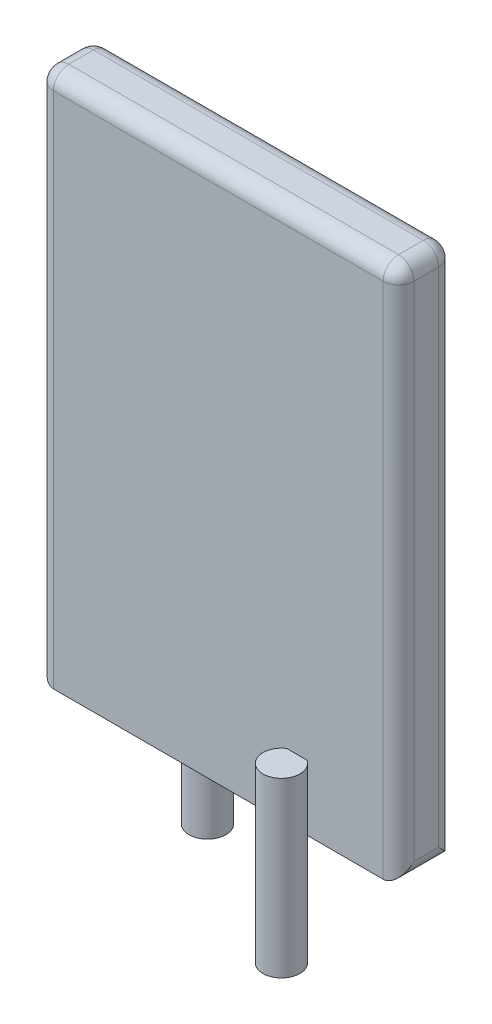
ISO-10303-21;
HEADER;
FILE_DESCRIPTION(('STEP AP214'),'2;1');
FILE_NAME('part.step','',(''),(''),'','','');
FILE_SCHEMA(('AUTOMOTIVE_DESIGN { 1 0 10303 214 1 1 1 1 }'));
ENDSEC;
DATA;
#1=APPLICATION_CONTEXT('core data for automotive mechanical design processes');
#2=APPLICATION_PROTOCOL_DEFINITION('international standard','automotive_design',2000,#1);
#3=PRODUCT_CONTEXT('',#1,'mechanical');
#4=PRODUCT('Part','Part','',(#3));
#5=PRODUCT_RELATED_PRODUCT_CATEGORY('part','',(#4));
#6=PRODUCT_DEFINITION_FORMATION('','',#4);
#7=PRODUCT_DEFINITION_CONTEXT('part definition',#1,'design');
#8=PRODUCT_DEFINITION('design','',#6,#7);
#9=PRODUCT_DEFINITION_SHAPE('','',#8);
#10=(LENGTH_UNIT() NAMED_UNIT(*) SI_UNIT(.MILLI.,.METRE.));
#11=(NAMED_UNIT(*) PLANE_ANGLE_UNIT() SI_UNIT($,.RADIAN.));
#12=(NAMED_UNIT(*) SI_UNIT($,.STERADIAN.) SOLID_ANGLE_UNIT());
#13=UNCERTAINTY_MEASURE_WITH_UNIT(LENGTH_MEASURE(1.E-05),#10,'distance_accuracy_value','');
#14=(GEOMETRIC_REPRESENTATION_CONTEXT(3) GLOBAL_UNCERTAINTY_ASSIGNED_CONTEXT((#13)) GLOBAL_UNIT_ASSIGNED_CONTEXT((#10,
#11,#12)) REPRESENTATION_CONTEXT('',''));
#15=CARTESIAN_POINT('',(0.,0.,0.));
#16=DIRECTION('',(0.,0.,1.));
#17=DIRECTION('',(1.,0.,0.));
#18=AXIS2_PLACEMENT_3D('',#15,#16,#17);
#19=CARTESIAN_POINT('',(-2.55,-12.15,-1.3));
#20=DIRECTION('',(0.,1.,0.));
#21=DIRECTION('',(0.,0.,1.));
#22=AXIS2_PLACEMENT_3D('',#19,#20,#21);
#23=PLANE('',#22);
#24=CARTESIAN_POINT('',(-2.55,-12.15,-1.3));
#25=DIRECTION('',(0.,1.,0.));
#26=DIRECTION('',(0.,0.,1.));
#27=AXIS2_PLACEMENT_3D('',#24,#25,#26);
#28=CIRCLE('',#27,0.599999999999999);
#29=CARTESIAN_POINT('',(-2.55,-12.15,-0.700000000000002));
#30=VERTEX_POINT('',#29);
#31=EDGE_CURVE('E11',#30,#30,#28,.T.);
#32=ORIENTED_EDGE('',*,*,#31,.F.);
#33=EDGE_LOOP('',(#32));
#34=FACE_BOUND('',#33,.T.);
#35=ADVANCED_FACE('F48',(#34),#23,.F.);
#36=CARTESIAN_POINT('',(-2.55,-2.22267848256585,-1.3));
#37=DIRECTION('',(0.,1.,0.));
#38=DIRECTION('',(0.,0.,1.));
#39=AXIS2_PLACEMENT_3D('',#36,#37,#38);
#40=CYLINDRICAL_SURFACE('',#39,0.599999999999999);
#41=CARTESIAN_POINT('',(-2.55,-6.5404643789514,-1.3));
#42=DIRECTION('',(0.,1.,0.));
#43=DIRECTION('',(0.,0.,1.));
#44=AXIS2_PLACEMENT_3D('',#41,#42,#43);
#45=CIRCLE('',#44,0.6);
#46=CARTESIAN_POINT('',(-2.55,-6.5404643789514,-0.700000000000001));
#47=VERTEX_POINT('',#46);
#48=EDGE_CURVE('E55',#47,#47,#45,.T.);
#49=ORIENTED_EDGE('',*,*,#48,.F.);
#50=EDGE_LOOP('',(#49));
#51=FACE_BOUND('',#50,.T.);
#52=ORIENTED_EDGE('',*,*,#31,.T.);
#53=EDGE_LOOP('',(#52));
#54=FACE_BOUND('',#53,.T.);
#55=ADVANCED_FACE('F64',(#51,#54),#40,.T.);
#56=CARTESIAN_POINT('',(-2.55,-6.5404643789514,-1.9));
#57=DIRECTION('',(0.,-1.,0.));
#58=DIRECTION('',(0.,0.,-1.));
#59=AXIS2_PLACEMENT_3D('',#56,#57,#58);
#60=PLANE('',#59);
#61=ORIENTED_EDGE('',*,*,#48,.T.);
#62=EDGE_LOOP('',(#61));
#63=FACE_BOUND('',#62,.T.);
#64=ADVANCED_FACE('F62',(#63),#60,.F.);
#65=CLOSED_SHELL('',(#35,#55,#64));
#66=MANIFOLD_SOLID_BREP('B2',#65);
#67=CARTESIAN_POINT('',(2.55,-12.15,1.4));
#68=DIRECTION('',(0.,1.,0.));
#69=DIRECTION('',(0.,0.,1.));
#70=AXIS2_PLACEMENT_3D('',#67,#68,#69);
#71=PLANE('',#70);
#72=CARTESIAN_POINT('',(2.55,-12.15,1.4));
#73=DIRECTION('',(0.,1.,0.));
#74=DIRECTION('',(0.,0.,1.));
#75=AXIS2_PLACEMENT_3D('',#72,#73,#74);
#76=CIRCLE('',#75,0.599999999999999);
#77=CARTESIAN_POINT('',(2.55,-12.15,2.));
#78=VERTEX_POINT('',#77);
#79=EDGE_CURVE('E47',#78,#78,#76,.T.);
#80=ORIENTED_EDGE('',*,*,#79,.F.);
#81=EDGE_LOOP('',(#80));
#82=FACE_BOUND('',#81,.T.);
#83=ADVANCED_FACE('F103',(#82),#71,.F.);
#84=CARTESIAN_POINT('',(2.55,-2.22267848256585,1.4));
#85=DIRECTION('',(0.,1.,0.));
#86=DIRECTION('',(0.,0.,1.));
#87=AXIS2_PLACEMENT_3D('',#84,#85,#86);
#88=CYLINDRICAL_SURFACE('',#87,0.599999999999999);
#89=CARTESIAN_POINT('',(2.55,-6.5404643789514,1.4));
#90=DIRECTION('',(0.,1.,0.));
#91=DIRECTION('',(0.,0.,1.));
#92=AXIS2_PLACEMENT_3D('',#89,#90,#91);
#93=CIRCLE('',#92,0.6);
#94=CARTESIAN_POINT('',(2.55,-6.5404643789514,2.));
#95=VERTEX_POINT('',#94);
#96=EDGE_CURVE('E110',#95,#95,#93,.T.);
#97=ORIENTED_EDGE('',*,*,#96,.F.);
#98=EDGE_LOOP('',(#97));
#99=FACE_BOUND('',#98,.T.);
#100=ORIENTED_EDGE('',*,*,#79,.T.);
#101=EDGE_LOOP('',(#100));
#102=FACE_BOUND('',#101,.T.);
#103=ADVANCED_FACE('F119',(#99,#102),#88,.T.);
#104=CARTESIAN_POINT('',(2.55,-6.5404643789514,0.8));
#105=DIRECTION('',(0.,-1.,0.));
#106=DIRECTION('',(0.,0.,-1.));
#107=AXIS2_PLACEMENT_3D('',#104,#105,#106);
#108=PLANE('',#107);
#109=ORIENTED_EDGE('',*,*,#96,.T.);
#110=EDGE_LOOP('',(#109));
#111=FACE_BOUND('',#110,.T.);
#112=ADVANCED_FACE('F117',(#111),#108,.F.);
#113=CLOSED_SHELL('',(#83,#103,#112));
#114=MANIFOLD_SOLID_BREP('B6',#113);
#115=CARTESIAN_POINT('',(-5.85,8.65,0.9));
#116=DIRECTION('',(1.,0.,0.));
#117=DIRECTION('',(0.,0.,-1.));
#118=AXIS2_PLACEMENT_3D('',#115,#116,#117);
#119=PLANE('',#118);
#120=DIRECTION('',(0.,-1.,0.));
#121=VECTOR('',#120,1.);
#122=CARTESIAN_POINT('',(-5.85,8.65,-0.4));
#123=LINE('',#122,#121);
#124=CARTESIAN_POINT('',(-5.85,8.15,-0.4));
#125=VERTEX_POINT('',#124);
#126=CARTESIAN_POINT('',(-5.85,-8.15,-0.4));
#127=VERTEX_POINT('',#126);
#128=EDGE_CURVE('E313',#125,#127,#123,.T.);
#129=ORIENTED_EDGE('',*,*,#128,.T.);
#130=DIRECTION('',(0.,0.,-1.));
#131=VECTOR('',#130,1.);
#132=CARTESIAN_POINT('',(-5.85,-8.15,0.9));
#133=LINE('',#132,#131);
#134=CARTESIAN_POINT('',(-5.85,-8.15,0.4));
#135=VERTEX_POINT('',#134);
#136=EDGE_CURVE('E174',#127,#135,#133,.F.);
#137=ORIENTED_EDGE('',*,*,#136,.T.);
#138=DIRECTION('',(0.,-1.,0.));
#139=VECTOR('',#138,1.);
#140=CARTESIAN_POINT('',(-5.85,8.65,0.4));
#141=LINE('',#140,#139);
#142=CARTESIAN_POINT('',(-5.85,8.15,0.4));
#143=VERTEX_POINT('',#142);
#144=EDGE_CURVE('E310',#135,#143,#141,.F.);
#145=ORIENTED_EDGE('',*,*,#144,.T.);
#146=DIRECTION('',(0.,0.,-1.));
#147=VECTOR('',#146,1.);
#148=CARTESIAN_POINT('',(-5.85,8.15,0.9));
#149=LINE('',#148,#147);
#150=EDGE_CURVE('E307',#143,#125,#149,.T.);
#151=ORIENTED_EDGE('',*,*,#150,.T.);
#152=EDGE_LOOP('',(#129,#137,#145,#151));
#153=FACE_BOUND('',#152,.T.);
#154=ADVANCED_FACE('F149',(#153),#119,.F.);
#155=CARTESIAN_POINT('',(-5.85,-8.65,0.9));
#156=DIRECTION('',(0.,1.,0.));
#157=DIRECTION('',(0.,0.,1.));
#158=AXIS2_PLACEMENT_3D('',#155,#156,#157);
#159=PLANE('',#158);
#160=DIRECTION('',(1.,0.,0.));
#161=VECTOR('',#160,1.);
#162=CARTESIAN_POINT('',(-5.85,-8.65,0.9));
#163=LINE('',#162,#161);
#164=CARTESIAN_POINT('',(-5.35,-8.65,0.9));
#165=VERTEX_POINT('',#164);
#166=CARTESIAN_POINT('',(5.35,-8.65,0.9));
#167=VERTEX_POINT('',#166);
#168=EDGE_CURVE('E263',#165,#167,#163,.T.);
#169=ORIENTED_EDGE('',*,*,#168,.F.);
#170=DIRECTION('',(0.,0.,-1.));
#171=VECTOR('',#170,1.);
#172=CARTESIAN_POINT('',(-5.35,-8.65,0.9));
#173=LINE('',#172,#171);
#174=CARTESIAN_POINT('',(-5.35,-8.65,-0.9));
#175=VERTEX_POINT('',#174);
#176=EDGE_CURVE('E101',#165,#175,#173,.T.);
#177=ORIENTED_EDGE('',*,*,#176,.T.);
#178=DIRECTION('',(1.,0.,0.));
#179=VECTOR('',#178,1.);
#180=CARTESIAN_POINT('',(-5.85,-8.65,-0.9));
#181=LINE('',#180,#179);
#182=CARTESIAN_POINT('',(5.35,-8.65,-0.9));
#183=VERTEX_POINT('',#182);
#184=EDGE_CURVE('E364',#175,#183,#181,.T.);
#185=ORIENTED_EDGE('',*,*,#184,.T.);
#186=DIRECTION('',(0.,0.,-1.));
#187=VECTOR('',#186,1.);
#188=CARTESIAN_POINT('',(5.35,-8.65,0.9));
#189=LINE('',#188,#187);
#190=EDGE_CURVE('E159',#183,#167,#189,.F.);
#191=ORIENTED_EDGE('',*,*,#190,.T.);
#192=EDGE_LOOP('',(#169,#177,#185,#191));
#193=FACE_BOUND('',#192,.T.);
#194=ADVANCED_FACE('F397',(#193),#159,.F.);
#195=CARTESIAN_POINT('',(5.85,8.65,0.9));
#196=DIRECTION('',(-1.,0.,0.));
#197=DIRECTION('',(0.,0.,1.));
#198=AXIS2_PLACEMENT_3D('',#195,#196,#197);
#199=PLANE('',#198);
#200=DIRECTION('',(0.,1.,0.));
#201=VECTOR('',#200,1.);
#202=CARTESIAN_POINT('',(5.85,-8.65,0.4));
#203=LINE('',#202,#201);
#204=CARTESIAN_POINT('',(5.85,8.15,0.4));
#205=VERTEX_POINT('',#204);
#206=CARTESIAN_POINT('',(5.85,-8.15,0.4));
#207=VERTEX_POINT('',#206);
#208=EDGE_CURVE('E297',#205,#207,#203,.F.);
#209=ORIENTED_EDGE('',*,*,#208,.T.);
#210=DIRECTION('',(0.,0.,-1.));
#211=VECTOR('',#210,1.);
#212=CARTESIAN_POINT('',(5.85,-8.15,0.9));
#213=LINE('',#212,#211);
#214=CARTESIAN_POINT('',(5.85,-8.15,-0.4));
#215=VERTEX_POINT('',#214);
#216=EDGE_CURVE('E304',#207,#215,#213,.T.);
#217=ORIENTED_EDGE('',*,*,#216,.T.);
#218=DIRECTION('',(0.,1.,0.));
#219=VECTOR('',#218,1.);
#220=CARTESIAN_POINT('',(5.85,8.65,-0.4));
#221=LINE('',#220,#219);
#222=CARTESIAN_POINT('',(5.85,8.15,-0.4));
#223=VERTEX_POINT('',#222);
#224=EDGE_CURVE('E300',#215,#223,#221,.T.);
#225=ORIENTED_EDGE('',*,*,#224,.T.);
#226=DIRECTION('',(0.,0.,-1.));
#227=VECTOR('',#226,1.);
#228=CARTESIAN_POINT('',(5.85,8.15,0.9));
#229=LINE('',#228,#227);
#230=EDGE_CURVE('E294',#223,#205,#229,.F.);
#231=ORIENTED_EDGE('',*,*,#230,.T.);
#232=EDGE_LOOP('',(#209,#217,#225,#231));
#233=FACE_BOUND('',#232,.T.);
#234=ADVANCED_FACE('F409',(#233),#199,.F.);
#235=CARTESIAN_POINT('',(-5.85,8.65,0.9));
#236=DIRECTION('',(0.,-1.,0.));
#237=DIRECTION('',(0.,0.,-1.));
#238=AXIS2_PLACEMENT_3D('',#235,#236,#237);
#239=PLANE('',#238);
#240=DIRECTION('',(-1.,0.,0.));
#241=VECTOR('',#240,1.);
#242=CARTESIAN_POINT('',(5.85,8.65,0.4));
#243=LINE('',#242,#241);
#244=CARTESIAN_POINT('',(-5.35,8.65,0.4));
#245=VERTEX_POINT('',#244);
#246=CARTESIAN_POINT('',(5.35,8.65,0.4));
#247=VERTEX_POINT('',#246);
#248=EDGE_CURVE('E262',#245,#247,#243,.F.);
#249=ORIENTED_EDGE('',*,*,#248,.T.);
#250=DIRECTION('',(0.,0.,-1.));
#251=VECTOR('',#250,1.);
#252=CARTESIAN_POINT('',(5.35,8.65,0.9));
#253=LINE('',#252,#251);
#254=CARTESIAN_POINT('',(5.35,8.65,-0.4));
#255=VERTEX_POINT('',#254);
#256=EDGE_CURVE('E267',#247,#255,#253,.T.);
#257=ORIENTED_EDGE('',*,*,#256,.T.);
#258=DIRECTION('',(-1.,0.,0.));
#259=VECTOR('',#258,1.);
#260=CARTESIAN_POINT('',(-5.85,8.65,-0.4));
#261=LINE('',#260,#259);
#262=CARTESIAN_POINT('',(-5.35,8.65,-0.4));
#263=VERTEX_POINT('',#262);
#264=EDGE_CURVE('E235',#255,#263,#261,.T.);
#265=ORIENTED_EDGE('',*,*,#264,.T.);
#266=DIRECTION('',(0.,0.,-1.));
#267=VECTOR('',#266,1.);
#268=CARTESIAN_POINT('',(-5.35,8.65,0.9));
#269=LINE('',#268,#267);
#270=EDGE_CURVE('E255',#263,#245,#269,.F.);
#271=ORIENTED_EDGE('',*,*,#270,.T.);
#272=EDGE_LOOP('',(#249,#257,#265,#271));
#273=FACE_BOUND('',#272,.T.);
#274=ADVANCED_FACE('F265',(#273),#239,.F.);
#275=CARTESIAN_POINT('',(0.,0.,0.9));
#276=DIRECTION('',(0.,0.,1.));
#277=DIRECTION('',(1.,0.,0.));
#278=AXIS2_PLACEMENT_3D('',#275,#276,#277);
#279=PLANE('',#278);
#280=ORIENTED_EDGE('',*,*,#168,.T.);
#281=DIRECTION('',(0.,1.,0.));
#282=VECTOR('',#281,1.);
#283=CARTESIAN_POINT('',(5.35,8.65,0.9));
#284=LINE('',#283,#282);
#285=CARTESIAN_POINT('',(5.35,8.15,0.9));
#286=VERTEX_POINT('',#285);
#287=EDGE_CURVE('E291',#167,#286,#284,.T.);
#288=ORIENTED_EDGE('',*,*,#287,.T.);
#289=DIRECTION('',(-1.,0.,0.));
#290=VECTOR('',#289,1.);
#291=CARTESIAN_POINT('',(-5.85,8.15,0.9));
#292=LINE('',#291,#290);
#293=CARTESIAN_POINT('',(-5.35,8.15,0.9));
#294=VERTEX_POINT('',#293);
#295=EDGE_CURVE('E288',#286,#294,#292,.T.);
#296=ORIENTED_EDGE('',*,*,#295,.T.);
#297=DIRECTION('',(0.,-1.,0.));
#298=VECTOR('',#297,1.);
#299=CARTESIAN_POINT('',(-5.35,-8.65,0.9));
#300=LINE('',#299,#298);
#301=EDGE_CURVE('E285',#294,#165,#300,.T.);
#302=ORIENTED_EDGE('',*,*,#301,.T.);
#303=EDGE_LOOP('',(#280,#288,#296,#302));
#304=FACE_BOUND('',#303,.T.);
#305=ADVANCED_FACE('F380',(#304),#279,.T.);
#306=CARTESIAN_POINT('',(0.,0.,-0.9));
#307=DIRECTION('',(0.,0.,1.));
#308=DIRECTION('',(1.,0.,0.));
#309=AXIS2_PLACEMENT_3D('',#306,#307,#308);
#310=PLANE('',#309);
#311=DIRECTION('',(-1.,0.,0.));
#312=VECTOR('',#311,1.);
#313=CARTESIAN_POINT('',(0.,8.15,-0.9));
#314=LINE('',#313,#312);
#315=CARTESIAN_POINT('',(-5.35,8.15,-0.9));
#316=VERTEX_POINT('',#315);
#317=CARTESIAN_POINT('',(5.35,8.15,-0.9));
#318=VERTEX_POINT('',#317);
#319=EDGE_CURVE('E237',#316,#318,#314,.F.);
#320=ORIENTED_EDGE('',*,*,#319,.T.);
#321=DIRECTION('',(0.,1.,0.));
#322=VECTOR('',#321,1.);
#323=CARTESIAN_POINT('',(5.35,0.,-0.9));
#324=LINE('',#323,#322);
#325=EDGE_CURVE('E282',#318,#183,#324,.F.);
#326=ORIENTED_EDGE('',*,*,#325,.T.);
#327=ORIENTED_EDGE('',*,*,#184,.F.);
#328=DIRECTION('',(0.,-1.,0.));
#329=VECTOR('',#328,1.);
#330=CARTESIAN_POINT('',(-5.35,0.,-0.9));
#331=LINE('',#330,#329);
#332=EDGE_CURVE('E274',#175,#316,#331,.F.);
#333=ORIENTED_EDGE('',*,*,#332,.T.);
#334=EDGE_LOOP('',(#320,#326,#327,#333));
#335=FACE_BOUND('',#334,.T.);
#336=ADVANCED_FACE('F399',(#335),#310,.F.);
#337=CARTESIAN_POINT('',(5.35,0.,0.4));
#338=DIRECTION('',(0.,-1.,0.));
#339=DIRECTION('',(0.,0.,-1.));
#340=AXIS2_PLACEMENT_3D('',#337,#338,#339);
#341=CYLINDRICAL_SURFACE('',#340,0.5);
#342=CARTESIAN_POINT('',(5.35,8.15,0.4));
#343=DIRECTION('',(0.,1.,0.));
#344=DIRECTION('',(0.,0.,1.));
#345=AXIS2_PLACEMENT_3D('',#342,#343,#344);
#346=CIRCLE('',#345,0.5);
#347=EDGE_CURVE('E357',#286,#205,#346,.T.);
#348=ORIENTED_EDGE('',*,*,#347,.F.);
#349=ORIENTED_EDGE('',*,*,#287,.F.);
#350=CARTESIAN_POINT('',(5.35,-8.15,0.4));
#351=DIRECTION('',(0.,-0.707106781186547,-0.707106781186547));
#352=DIRECTION('',(0.,0.707106781186547,-0.707106781186547));
#353=AXIS2_PLACEMENT_3D('',#350,#351,#352);
#354=ELLIPSE('',#353,0.707106781186547,0.5);
#355=EDGE_CURVE('E153',#207,#167,#354,.T.);
#356=ORIENTED_EDGE('',*,*,#355,.F.);
#357=ORIENTED_EDGE('',*,*,#208,.F.);
#358=EDGE_LOOP('',(#348,#349,#356,#357));
#359=FACE_BOUND('',#358,.T.);
#360=ADVANCED_FACE('F151',(#359),#341,.T.);
#361=CARTESIAN_POINT('',(0.,8.15,0.4));
#362=DIRECTION('',(1.,0.,0.));
#363=DIRECTION('',(0.,0.,-1.));
#364=AXIS2_PLACEMENT_3D('',#361,#362,#363);
#365=CYLINDRICAL_SURFACE('',#364,0.5);
#366=CARTESIAN_POINT('',(-5.35,8.15,0.4));
#367=DIRECTION('',(-1.,0.,0.));
#368=DIRECTION('',(0.,0.,1.));
#369=AXIS2_PLACEMENT_3D('',#366,#367,#368);
#370=CIRCLE('',#369,0.5);
#371=EDGE_CURVE('E350',#294,#245,#370,.T.);
#372=ORIENTED_EDGE('',*,*,#371,.F.);
#373=ORIENTED_EDGE('',*,*,#295,.F.);
#374=CARTESIAN_POINT('',(5.35,8.15,0.4));
#375=DIRECTION('',(1.,0.,0.));
#376=DIRECTION('',(0.,0.,-1.));
#377=AXIS2_PLACEMENT_3D('',#374,#375,#376);
#378=CIRCLE('',#377,0.5);
#379=EDGE_CURVE('E354',#247,#286,#378,.T.);
#380=ORIENTED_EDGE('',*,*,#379,.F.);
#381=ORIENTED_EDGE('',*,*,#248,.F.);
#382=EDGE_LOOP('',(#372,#373,#380,#381));
#383=FACE_BOUND('',#382,.T.);
#384=ADVANCED_FACE('F390',(#383),#365,.T.);
#385=CARTESIAN_POINT('',(-5.35,0.,0.4));
#386=DIRECTION('',(0.,1.,0.));
#387=DIRECTION('',(0.,0.,1.));
#388=AXIS2_PLACEMENT_3D('',#385,#386,#387);
#389=CYLINDRICAL_SURFACE('',#388,0.5);
#390=CARTESIAN_POINT('',(-5.35,-8.15,0.4));
#391=DIRECTION('',(0.,-0.707106781186547,-0.707106781186547));
#392=DIRECTION('',(0.,0.707106781186547,-0.707106781186547));
#393=AXIS2_PLACEMENT_3D('',#390,#391,#392);
#394=ELLIPSE('',#393,0.707106781186547,0.5);
#395=EDGE_CURVE('E342',#165,#135,#394,.T.);
#396=ORIENTED_EDGE('',*,*,#395,.F.);
#397=ORIENTED_EDGE('',*,*,#301,.F.);
#398=CARTESIAN_POINT('',(-5.35,8.15,0.4));
#399=DIRECTION('',(0.,1.,0.));
#400=DIRECTION('',(0.,0.,1.));
#401=AXIS2_PLACEMENT_3D('',#398,#399,#400);
#402=CIRCLE('',#401,0.5);
#403=EDGE_CURVE('E346',#143,#294,#402,.T.);
#404=ORIENTED_EDGE('',*,*,#403,.F.);
#405=ORIENTED_EDGE('',*,*,#144,.F.);
#406=EDGE_LOOP('',(#396,#397,#404,#405));
#407=FACE_BOUND('',#406,.T.);
#408=ADVANCED_FACE('F393',(#407),#389,.T.);
#409=CARTESIAN_POINT('',(5.35,-8.15,0.9));
#410=DIRECTION('',(0.,0.,-1.));
#411=DIRECTION('',(-1.,0.,0.));
#412=AXIS2_PLACEMENT_3D('',#409,#410,#411);
#413=CYLINDRICAL_SURFACE('',#412,0.5);
#414=ORIENTED_EDGE('',*,*,#355,.T.);
#415=ORIENTED_EDGE('',*,*,#190,.F.);
#416=CARTESIAN_POINT('',(5.35,-8.15,-0.4));
#417=DIRECTION('',(0.,0.707106781186547,-0.707106781186547));
#418=DIRECTION('',(0.,-0.707106781186547,-0.707106781186547));
#419=AXIS2_PLACEMENT_3D('',#416,#417,#418);
#420=ELLIPSE('',#419,0.707106781186547,0.5);
#421=EDGE_CURVE('E338',#215,#183,#420,.T.);
#422=ORIENTED_EDGE('',*,*,#421,.F.);
#423=ORIENTED_EDGE('',*,*,#216,.F.);
#424=EDGE_LOOP('',(#414,#415,#422,#423));
#425=FACE_BOUND('',#424,.T.);
#426=ADVANCED_FACE('F407',(#425),#413,.T.);
#427=CARTESIAN_POINT('',(5.35,8.15,0.4));
#428=DIRECTION('',(0.,0.,1.));
#429=DIRECTION('',(1.,0.,0.));
#430=AXIS2_PLACEMENT_3D('',#427,#428,#429);
#431=SPHERICAL_SURFACE('',#430,0.5);
#432=ORIENTED_EDGE('',*,*,#379,.T.);
#433=ORIENTED_EDGE('',*,*,#347,.T.);
#434=CARTESIAN_POINT('',(5.35,8.15,0.4));
#435=DIRECTION('',(0.,0.,1.));
#436=DIRECTION('',(1.,0.,0.));
#437=AXIS2_PLACEMENT_3D('',#434,#435,#436);
#438=CIRCLE('',#437,0.5);
#439=EDGE_CURVE('E334',#247,#205,#438,.F.);
#440=ORIENTED_EDGE('',*,*,#439,.F.);
#441=EDGE_LOOP('',(#432,#433,#440));
#442=FACE_BOUND('',#441,.T.);
#443=ADVANCED_FACE('F387',(#442),#431,.T.);
#444=CARTESIAN_POINT('',(-5.35,8.15,0.4));
#445=DIRECTION('',(0.,0.,1.));
#446=DIRECTION('',(1.,0.,0.));
#447=AXIS2_PLACEMENT_3D('',#444,#445,#446);
#448=SPHERICAL_SURFACE('',#447,0.5);
#449=ORIENTED_EDGE('',*,*,#403,.T.);
#450=ORIENTED_EDGE('',*,*,#371,.T.);
#451=CARTESIAN_POINT('',(-5.35,8.15,0.4));
#452=DIRECTION('',(0.,0.,1.));
#453=DIRECTION('',(1.,0.,0.));
#454=AXIS2_PLACEMENT_3D('',#451,#452,#453);
#455=CIRCLE('',#454,0.5);
#456=EDGE_CURVE('E258',#143,#245,#455,.F.);
#457=ORIENTED_EDGE('',*,*,#456,.F.);
#458=EDGE_LOOP('',(#449,#450,#457));
#459=FACE_BOUND('',#458,.T.);
#460=ADVANCED_FACE('F474',(#459),#448,.T.);
#461=CARTESIAN_POINT('',(-5.35,-8.15,0.9));
#462=DIRECTION('',(0.,0.,-1.));
#463=DIRECTION('',(-1.,0.,0.));
#464=AXIS2_PLACEMENT_3D('',#461,#462,#463);
#465=CYLINDRICAL_SURFACE('',#464,0.5);
#466=ORIENTED_EDGE('',*,*,#395,.T.);
#467=ORIENTED_EDGE('',*,*,#136,.F.);
#468=CARTESIAN_POINT('',(-5.35,-8.15,-0.4));
#469=DIRECTION('',(0.,0.707106781186547,-0.707106781186547));
#470=DIRECTION('',(0.,-0.707106781186547,-0.707106781186547));
#471=AXIS2_PLACEMENT_3D('',#468,#469,#470);
#472=ELLIPSE('',#471,0.707106781186547,0.5);
#473=EDGE_CURVE('E167',#175,#127,#472,.T.);
#474=ORIENTED_EDGE('',*,*,#473,.F.);
#475=ORIENTED_EDGE('',*,*,#176,.F.);
#476=EDGE_LOOP('',(#466,#467,#474,#475));
#477=FACE_BOUND('',#476,.T.);
#478=ADVANCED_FACE('F396',(#477),#465,.T.);
#479=CARTESIAN_POINT('',(5.35,8.65,-0.4));
#480=DIRECTION('',(0.,1.,0.));
#481=DIRECTION('',(0.,0.,1.));
#482=AXIS2_PLACEMENT_3D('',#479,#480,#481);
#483=CYLINDRICAL_SURFACE('',#482,0.5);
#484=ORIENTED_EDGE('',*,*,#421,.T.);
#485=ORIENTED_EDGE('',*,*,#325,.F.);
#486=CARTESIAN_POINT('',(5.35,8.15,-0.4));
#487=DIRECTION('',(0.,1.,0.));
#488=DIRECTION('',(0.,0.,1.));
#489=AXIS2_PLACEMENT_3D('',#486,#487,#488);
#490=CIRCLE('',#489,0.5);
#491=EDGE_CURVE('E326',#223,#318,#490,.T.);
#492=ORIENTED_EDGE('',*,*,#491,.F.);
#493=ORIENTED_EDGE('',*,*,#224,.F.);
#494=EDGE_LOOP('',(#484,#485,#492,#493));
#495=FACE_BOUND('',#494,.T.);
#496=ADVANCED_FACE('F403',(#495),#483,.T.);
#497=CARTESIAN_POINT('',(5.35,8.15,0.9));
#498=DIRECTION('',(0.,0.,-1.));
#499=DIRECTION('',(-1.,0.,0.));
#500=AXIS2_PLACEMENT_3D('',#497,#498,#499);
#501=CYLINDRICAL_SURFACE('',#500,0.5);
#502=ORIENTED_EDGE('',*,*,#439,.T.);
#503=ORIENTED_EDGE('',*,*,#230,.F.);
#504=CARTESIAN_POINT('',(5.35,8.15,-0.4));
#505=DIRECTION('',(0.,0.,-1.));
#506=DIRECTION('',(-1.,0.,0.));
#507=AXIS2_PLACEMENT_3D('',#504,#505,#506);
#508=CIRCLE('',#507,0.5);
#509=EDGE_CURVE('E252',#255,#223,#508,.T.);
#510=ORIENTED_EDGE('',*,*,#509,.F.);
#511=ORIENTED_EDGE('',*,*,#256,.F.);
#512=EDGE_LOOP('',(#502,#503,#510,#511));
#513=FACE_BOUND('',#512,.T.);
#514=ADVANCED_FACE('F411',(#513),#501,.T.);
#515=CARTESIAN_POINT('',(-5.35,8.15,0.9));
#516=DIRECTION('',(0.,0.,-1.));
#517=DIRECTION('',(-1.,0.,0.));
#518=AXIS2_PLACEMENT_3D('',#515,#516,#517);
#519=CYLINDRICAL_SURFACE('',#518,0.5);
#520=ORIENTED_EDGE('',*,*,#456,.T.);
#521=ORIENTED_EDGE('',*,*,#270,.F.);
#522=CARTESIAN_POINT('',(-5.35,8.15,-0.4));
#523=DIRECTION('',(0.,0.,-1.));
#524=DIRECTION('',(-1.,0.,0.));
#525=AXIS2_PLACEMENT_3D('',#522,#523,#524);
#526=CIRCLE('',#525,0.5);
#527=EDGE_CURVE('E244',#125,#263,#526,.T.);
#528=ORIENTED_EDGE('',*,*,#527,.F.);
#529=ORIENTED_EDGE('',*,*,#150,.F.);
#530=EDGE_LOOP('',(#520,#521,#528,#529));
#531=FACE_BOUND('',#530,.T.);
#532=ADVANCED_FACE('F256',(#531),#519,.T.);
#533=CARTESIAN_POINT('',(-5.35,8.65,-0.4));
#534=DIRECTION('',(0.,-1.,0.));
#535=DIRECTION('',(0.,0.,-1.));
#536=AXIS2_PLACEMENT_3D('',#533,#534,#535);
#537=CYLINDRICAL_SURFACE('',#536,0.5);
#538=ORIENTED_EDGE('',*,*,#473,.T.);
#539=ORIENTED_EDGE('',*,*,#128,.F.);
#540=CARTESIAN_POINT('',(-5.35,8.15,-0.4));
#541=DIRECTION('',(0.,1.,0.));
#542=DIRECTION('',(0.,0.,1.));
#543=AXIS2_PLACEMENT_3D('',#540,#541,#542);
#544=CIRCLE('',#543,0.5);
#545=EDGE_CURVE('E248',#316,#125,#544,.T.);
#546=ORIENTED_EDGE('',*,*,#545,.F.);
#547=ORIENTED_EDGE('',*,*,#332,.F.);
#548=EDGE_LOOP('',(#538,#539,#546,#547));
#549=FACE_BOUND('',#548,.T.);
#550=ADVANCED_FACE('F416',(#549),#537,.T.);
#551=CARTESIAN_POINT('',(5.35,8.15,-0.4));
#552=DIRECTION('',(0.,0.,1.));
#553=DIRECTION('',(1.,0.,0.));
#554=AXIS2_PLACEMENT_3D('',#551,#552,#553);
#555=SPHERICAL_SURFACE('',#554,0.5);
#556=ORIENTED_EDGE('',*,*,#509,.T.);
#557=ORIENTED_EDGE('',*,*,#491,.T.);
#558=CARTESIAN_POINT('',(5.35,8.15,-0.4));
#559=DIRECTION('',(1.,0.,0.));
#560=DIRECTION('',(0.,1.,0.));
#561=AXIS2_PLACEMENT_3D('',#558,#559,#560);
#562=CIRCLE('',#561,0.5);
#563=EDGE_CURVE('E241',#255,#318,#562,.F.);
#564=ORIENTED_EDGE('',*,*,#563,.F.);
#565=EDGE_LOOP('',(#556,#557,#564));
#566=FACE_BOUND('',#565,.T.);
#567=ADVANCED_FACE('F414',(#566),#555,.T.);
#568=CARTESIAN_POINT('',(-5.35,8.15,-0.4));
#569=DIRECTION('',(0.,0.,1.));
#570=DIRECTION('',(1.,0.,0.));
#571=AXIS2_PLACEMENT_3D('',#568,#569,#570);
#572=SPHERICAL_SURFACE('',#571,0.5);
#573=ORIENTED_EDGE('',*,*,#545,.T.);
#574=ORIENTED_EDGE('',*,*,#527,.T.);
#575=CARTESIAN_POINT('',(-5.35,8.15,-0.4));
#576=DIRECTION('',(-1.,0.,0.));
#577=DIRECTION('',(0.,0.,1.));
#578=AXIS2_PLACEMENT_3D('',#575,#576,#577);
#579=CIRCLE('',#578,0.5);
#580=EDGE_CURVE('E231',#316,#263,#579,.F.);
#581=ORIENTED_EDGE('',*,*,#580,.F.);
#582=EDGE_LOOP('',(#573,#574,#581));
#583=FACE_BOUND('',#582,.T.);
#584=ADVANCED_FACE('F246',(#583),#572,.T.);
#585=CARTESIAN_POINT('',(-5.85,8.15,-0.4));
#586=DIRECTION('',(-1.,0.,0.));
#587=DIRECTION('',(0.,0.,1.));
#588=AXIS2_PLACEMENT_3D('',#585,#586,#587);
#589=CYLINDRICAL_SURFACE('',#588,0.5);
#590=ORIENTED_EDGE('',*,*,#563,.T.);
#591=ORIENTED_EDGE('',*,*,#319,.F.);
#592=ORIENTED_EDGE('',*,*,#580,.T.);
#593=ORIENTED_EDGE('',*,*,#264,.F.);
#594=EDGE_LOOP('',(#590,#591,#592,#593));
#595=FACE_BOUND('',#594,.T.);
#596=ADVANCED_FACE('F233',(#595),#589,.T.);
#597=CLOSED_SHELL('',(#154,#194,#234,#274,#305,#336,#360,#384,#408,#426,#443,#460,#478,#496,
#514,#532,#550,#567,#584,#596));
#598=MANIFOLD_SOLID_BREP('B42',#597);
#599=ADVANCED_BREP_SHAPE_REPRESENTATION('',(#18,#66,#114,#598),#14);
#600=SHAPE_DEFINITION_REPRESENTATION(#9,#599);
ENDSEC;
END-ISO-10303-21;
